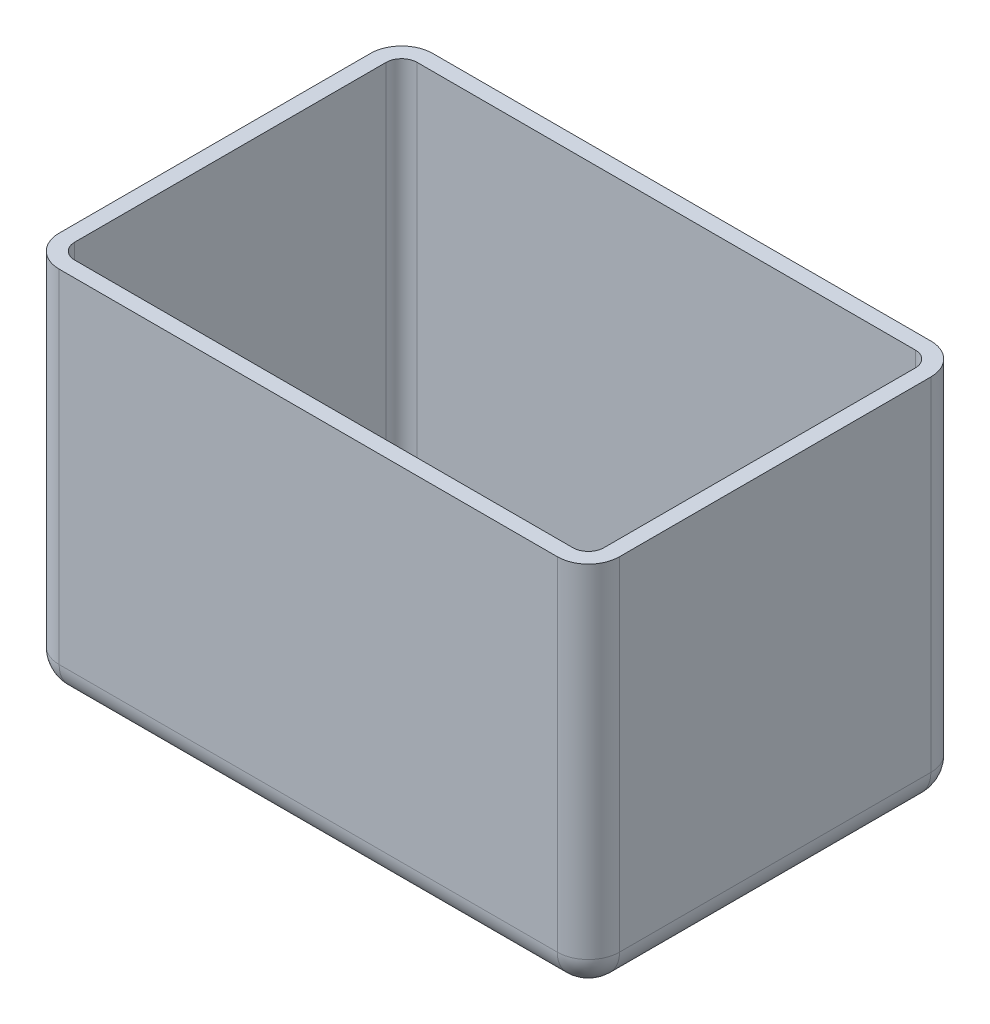
ISO-10303-21;
HEADER;
FILE_DESCRIPTION(('STEP AP214'),'2;1');
FILE_NAME('part.step','',(''),(''),'','','');
FILE_SCHEMA(('AUTOMOTIVE_DESIGN { 1 0 10303 214 1 1 1 1 }'));
ENDSEC;
DATA;
#1=APPLICATION_CONTEXT('core data for automotive mechanical design processes');
#2=APPLICATION_PROTOCOL_DEFINITION('international standard','automotive_design',2000,#1);
#3=PRODUCT_CONTEXT('',#1,'mechanical');
#4=PRODUCT('Part','Part','',(#3));
#5=PRODUCT_RELATED_PRODUCT_CATEGORY('part','',(#4));
#6=PRODUCT_DEFINITION_FORMATION('','',#4);
#7=PRODUCT_DEFINITION_CONTEXT('part definition',#1,'design');
#8=PRODUCT_DEFINITION('design','',#6,#7);
#9=PRODUCT_DEFINITION_SHAPE('','',#8);
#10=(LENGTH_UNIT() NAMED_UNIT(*) SI_UNIT(.MILLI.,.METRE.));
#11=(NAMED_UNIT(*) PLANE_ANGLE_UNIT() SI_UNIT($,.RADIAN.));
#12=(NAMED_UNIT(*) SI_UNIT($,.STERADIAN.) SOLID_ANGLE_UNIT());
#13=UNCERTAINTY_MEASURE_WITH_UNIT(LENGTH_MEASURE(1.E-05),#10,'distance_accuracy_value','');
#14=(GEOMETRIC_REPRESENTATION_CONTEXT(3) GLOBAL_UNCERTAINTY_ASSIGNED_CONTEXT((#13)) GLOBAL_UNIT_ASSIGNED_CONTEXT((#10,
#11,#12)) REPRESENTATION_CONTEXT('',''));
#15=CARTESIAN_POINT('',(0.,0.,0.));
#16=DIRECTION('',(0.,0.,1.));
#17=DIRECTION('',(1.,0.,0.));
#18=AXIS2_PLACEMENT_3D('',#15,#16,#17);
#19=CARTESIAN_POINT('',(-203.2,25.4,127.));
#20=DIRECTION('',(0.,0.,1.));
#21=DIRECTION('',(1.,0.,0.));
#22=AXIS2_PLACEMENT_3D('',#19,#20,#21);
#23=SPHERICAL_SURFACE('',#22,25.4);
#24=CARTESIAN_POINT('',(-203.2,25.4,127.));
#25=DIRECTION('',(0.,1.,0.));
#26=DIRECTION('',(0.,0.,1.));
#27=AXIS2_PLACEMENT_3D('',#24,#25,#26);
#28=CIRCLE('',#27,25.4);
#29=CARTESIAN_POINT('',(-228.6,25.4,127.));
#30=VERTEX_POINT('',#29);
#31=CARTESIAN_POINT('',(-203.2,25.4,152.4));
#32=VERTEX_POINT('',#31);
#33=EDGE_CURVE('E11',#30,#32,#28,.T.);
#34=ORIENTED_EDGE('',*,*,#33,.F.);
#35=CARTESIAN_POINT('',(-203.2,25.4,127.));
#36=DIRECTION('',(0.,0.,-1.));
#37=DIRECTION('',(-1.,0.,0.));
#38=AXIS2_PLACEMENT_3D('',#35,#36,#37);
#39=CIRCLE('',#38,25.4);
#40=CARTESIAN_POINT('',(-203.2,0.,127.));
#41=VERTEX_POINT('',#40);
#42=EDGE_CURVE('E354',#41,#30,#39,.T.);
#43=ORIENTED_EDGE('',*,*,#42,.F.);
#44=CARTESIAN_POINT('',(-203.2,25.4,127.));
#45=DIRECTION('',(-1.,0.,0.));
#46=DIRECTION('',(0.,0.,1.));
#47=AXIS2_PLACEMENT_3D('',#44,#45,#46);
#48=CIRCLE('',#47,25.4);
#49=EDGE_CURVE('E357',#32,#41,#48,.F.);
#50=ORIENTED_EDGE('',*,*,#49,.F.);
#51=EDGE_LOOP('',(#34,#43,#50));
#52=FACE_BOUND('',#51,.T.);
#53=ADVANCED_FACE('F36',(#52),#23,.T.);
#54=CARTESIAN_POINT('',(-203.2,304.8,127.));
#55=DIRECTION('',(0.,1.,0.));
#56=DIRECTION('',(0.,0.,1.));
#57=AXIS2_PLACEMENT_3D('',#54,#55,#56);
#58=CYLINDRICAL_SURFACE('',#57,25.4);
#59=DIRECTION('',(0.,1.,0.));
#60=VECTOR('',#59,1.);
#61=CARTESIAN_POINT('',(-228.6,304.8,127.));
#62=LINE('',#61,#60);
#63=CARTESIAN_POINT('',(-228.6,304.8,127.));
#64=VERTEX_POINT('',#63);
#65=EDGE_CURVE('E359',#30,#64,#62,.T.);
#66=ORIENTED_EDGE('',*,*,#65,.F.);
#67=ORIENTED_EDGE('',*,*,#33,.T.);
#68=DIRECTION('',(0.,1.,0.));
#69=VECTOR('',#68,1.);
#70=CARTESIAN_POINT('',(-203.2,304.8,152.4));
#71=LINE('',#70,#69);
#72=CARTESIAN_POINT('',(-203.2,304.8,152.4));
#73=VERTEX_POINT('',#72);
#74=EDGE_CURVE('E362',#73,#32,#71,.F.);
#75=ORIENTED_EDGE('',*,*,#74,.F.);
#76=CARTESIAN_POINT('',(-203.2,304.8,127.));
#77=DIRECTION('',(0.,-1.,0.));
#78=DIRECTION('',(0.,0.,-1.));
#79=AXIS2_PLACEMENT_3D('',#76,#77,#78);
#80=CIRCLE('',#79,25.4);
#81=EDGE_CURVE('E44',#64,#73,#80,.F.);
#82=ORIENTED_EDGE('',*,*,#81,.F.);
#83=EDGE_LOOP('',(#66,#67,#75,#82));
#84=FACE_BOUND('',#83,.T.);
#85=ADVANCED_FACE('F38',(#84),#58,.T.);
#86=CARTESIAN_POINT('',(-203.2,25.4,-127.));
#87=DIRECTION('',(0.,0.,1.));
#88=DIRECTION('',(1.,0.,0.));
#89=AXIS2_PLACEMENT_3D('',#86,#87,#88);
#90=SPHERICAL_SURFACE('',#89,25.4);
#91=CARTESIAN_POINT('',(-203.2,25.4,-127.));
#92=DIRECTION('',(0.,1.,0.));
#93=DIRECTION('',(0.,0.,1.));
#94=AXIS2_PLACEMENT_3D('',#91,#92,#93);
#95=CIRCLE('',#94,25.4);
#96=CARTESIAN_POINT('',(-203.2,25.4,-152.4));
#97=VERTEX_POINT('',#96);
#98=CARTESIAN_POINT('',(-228.6,25.4,-127.));
#99=VERTEX_POINT('',#98);
#100=EDGE_CURVE('E352',#97,#99,#95,.T.);
#101=ORIENTED_EDGE('',*,*,#100,.F.);
#102=CARTESIAN_POINT('',(-203.2,25.4,-127.));
#103=DIRECTION('',(1.,0.,0.));
#104=DIRECTION('',(0.,0.,-1.));
#105=AXIS2_PLACEMENT_3D('',#102,#103,#104);
#106=CIRCLE('',#105,25.4);
#107=CARTESIAN_POINT('',(-203.2,0.,-127.));
#108=VERTEX_POINT('',#107);
#109=EDGE_CURVE('E339',#108,#97,#106,.T.);
#110=ORIENTED_EDGE('',*,*,#109,.F.);
#111=CARTESIAN_POINT('',(-203.2,25.4,-127.));
#112=DIRECTION('',(0.,0.,-1.));
#113=DIRECTION('',(-1.,0.,0.));
#114=AXIS2_PLACEMENT_3D('',#111,#112,#113);
#115=CIRCLE('',#114,25.4);
#116=EDGE_CURVE('E342',#99,#108,#115,.F.);
#117=ORIENTED_EDGE('',*,*,#116,.F.);
#118=EDGE_LOOP('',(#101,#110,#117));
#119=FACE_BOUND('',#118,.T.);
#120=ADVANCED_FACE('F438',(#119),#90,.T.);
#121=CARTESIAN_POINT('',(-203.2,304.8,-127.));
#122=DIRECTION('',(0.,1.,0.));
#123=DIRECTION('',(0.,0.,1.));
#124=AXIS2_PLACEMENT_3D('',#121,#122,#123);
#125=CYLINDRICAL_SURFACE('',#124,25.4);
#126=DIRECTION('',(0.,1.,0.));
#127=VECTOR('',#126,1.);
#128=CARTESIAN_POINT('',(-203.2,304.8,-152.4));
#129=LINE('',#128,#127);
#130=CARTESIAN_POINT('',(-203.2,304.8,-152.4));
#131=VERTEX_POINT('',#130);
#132=EDGE_CURVE('E344',#97,#131,#129,.T.);
#133=ORIENTED_EDGE('',*,*,#132,.F.);
#134=ORIENTED_EDGE('',*,*,#100,.T.);
#135=DIRECTION('',(0.,1.,0.));
#136=VECTOR('',#135,1.);
#137=CARTESIAN_POINT('',(-228.6,304.8,-127.));
#138=LINE('',#137,#136);
#139=CARTESIAN_POINT('',(-228.6,304.8,-127.));
#140=VERTEX_POINT('',#139);
#141=EDGE_CURVE('E347',#140,#99,#138,.F.);
#142=ORIENTED_EDGE('',*,*,#141,.F.);
#143=CARTESIAN_POINT('',(-203.2,304.8,-127.));
#144=DIRECTION('',(0.,-1.,0.));
#145=DIRECTION('',(0.,0.,-1.));
#146=AXIS2_PLACEMENT_3D('',#143,#144,#145);
#147=CIRCLE('',#146,25.4);
#148=EDGE_CURVE('E350',#131,#140,#147,.F.);
#149=ORIENTED_EDGE('',*,*,#148,.F.);
#150=EDGE_LOOP('',(#133,#134,#142,#149));
#151=FACE_BOUND('',#150,.T.);
#152=ADVANCED_FACE('F414',(#151),#125,.T.);
#153=CARTESIAN_POINT('',(203.2,25.4,-127.));
#154=DIRECTION('',(0.,0.,1.));
#155=DIRECTION('',(1.,0.,0.));
#156=AXIS2_PLACEMENT_3D('',#153,#154,#155);
#157=SPHERICAL_SURFACE('',#156,25.4);
#158=CARTESIAN_POINT('',(203.2,25.4,-127.));
#159=DIRECTION('',(0.,1.,0.));
#160=DIRECTION('',(0.,0.,1.));
#161=AXIS2_PLACEMENT_3D('',#158,#159,#160);
#162=CIRCLE('',#161,25.4);
#163=CARTESIAN_POINT('',(228.6,25.4,-127.));
#164=VERTEX_POINT('',#163);
#165=CARTESIAN_POINT('',(203.2,25.4,-152.4));
#166=VERTEX_POINT('',#165);
#167=EDGE_CURVE('E337',#164,#166,#162,.T.);
#168=ORIENTED_EDGE('',*,*,#167,.F.);
#169=CARTESIAN_POINT('',(203.2,25.4,-127.));
#170=DIRECTION('',(0.,0.,1.));
#171=DIRECTION('',(1.,0.,0.));
#172=AXIS2_PLACEMENT_3D('',#169,#170,#171);
#173=CIRCLE('',#172,25.4);
#174=CARTESIAN_POINT('',(203.2,0.,-127.));
#175=VERTEX_POINT('',#174);
#176=EDGE_CURVE('E324',#175,#164,#173,.T.);
#177=ORIENTED_EDGE('',*,*,#176,.F.);
#178=CARTESIAN_POINT('',(203.2,25.4,-127.));
#179=DIRECTION('',(1.,0.,0.));
#180=DIRECTION('',(0.,0.,-1.));
#181=AXIS2_PLACEMENT_3D('',#178,#179,#180);
#182=CIRCLE('',#181,25.4);
#183=EDGE_CURVE('E327',#166,#175,#182,.F.);
#184=ORIENTED_EDGE('',*,*,#183,.F.);
#185=EDGE_LOOP('',(#168,#177,#184));
#186=FACE_BOUND('',#185,.T.);
#187=ADVANCED_FACE('F401',(#186),#157,.T.);
#188=CARTESIAN_POINT('',(203.2,304.8,-127.));
#189=DIRECTION('',(0.,1.,0.));
#190=DIRECTION('',(0.,0.,1.));
#191=AXIS2_PLACEMENT_3D('',#188,#189,#190);
#192=CYLINDRICAL_SURFACE('',#191,25.4);
#193=DIRECTION('',(0.,1.,0.));
#194=VECTOR('',#193,1.);
#195=CARTESIAN_POINT('',(228.6,304.8,-127.));
#196=LINE('',#195,#194);
#197=CARTESIAN_POINT('',(228.6,304.8,-127.));
#198=VERTEX_POINT('',#197);
#199=EDGE_CURVE('E329',#164,#198,#196,.T.);
#200=ORIENTED_EDGE('',*,*,#199,.F.);
#201=ORIENTED_EDGE('',*,*,#167,.T.);
#202=DIRECTION('',(0.,1.,0.));
#203=VECTOR('',#202,1.);
#204=CARTESIAN_POINT('',(203.2,304.8,-152.4));
#205=LINE('',#204,#203);
#206=CARTESIAN_POINT('',(203.2,304.8,-152.4));
#207=VERTEX_POINT('',#206);
#208=EDGE_CURVE('E332',#207,#166,#205,.F.);
#209=ORIENTED_EDGE('',*,*,#208,.F.);
#210=CARTESIAN_POINT('',(203.2,304.8,-127.));
#211=DIRECTION('',(0.,-1.,0.));
#212=DIRECTION('',(0.,0.,-1.));
#213=AXIS2_PLACEMENT_3D('',#210,#211,#212);
#214=CIRCLE('',#213,25.4);
#215=EDGE_CURVE('E335',#198,#207,#214,.F.);
#216=ORIENTED_EDGE('',*,*,#215,.F.);
#217=EDGE_LOOP('',(#200,#201,#209,#216));
#218=FACE_BOUND('',#217,.T.);
#219=ADVANCED_FACE('F394',(#218),#192,.T.);
#220=CARTESIAN_POINT('',(203.2,25.4,127.));
#221=DIRECTION('',(0.,0.,1.));
#222=DIRECTION('',(1.,0.,0.));
#223=AXIS2_PLACEMENT_3D('',#220,#221,#222);
#224=SPHERICAL_SURFACE('',#223,25.4);
#225=CARTESIAN_POINT('',(203.2,25.4,127.));
#226=DIRECTION('',(0.,1.,0.));
#227=DIRECTION('',(0.,0.,1.));
#228=AXIS2_PLACEMENT_3D('',#225,#226,#227);
#229=CIRCLE('',#228,25.4);
#230=CARTESIAN_POINT('',(203.2,25.4,152.4));
#231=VERTEX_POINT('',#230);
#232=CARTESIAN_POINT('',(228.6,25.4,127.));
#233=VERTEX_POINT('',#232);
#234=EDGE_CURVE('E322',#231,#233,#229,.T.);
#235=ORIENTED_EDGE('',*,*,#234,.F.);
#236=CARTESIAN_POINT('',(203.2,25.4,127.));
#237=DIRECTION('',(-1.,0.,0.));
#238=DIRECTION('',(0.,0.,1.));
#239=AXIS2_PLACEMENT_3D('',#236,#237,#238);
#240=CIRCLE('',#239,25.4);
#241=CARTESIAN_POINT('',(203.2,0.,127.));
#242=VERTEX_POINT('',#241);
#243=EDGE_CURVE('E309',#242,#231,#240,.T.);
#244=ORIENTED_EDGE('',*,*,#243,.F.);
#245=CARTESIAN_POINT('',(203.2,25.4,127.));
#246=DIRECTION('',(0.,0.,1.));
#247=DIRECTION('',(1.,0.,0.));
#248=AXIS2_PLACEMENT_3D('',#245,#246,#247);
#249=CIRCLE('',#248,25.4);
#250=EDGE_CURVE('E312',#233,#242,#249,.F.);
#251=ORIENTED_EDGE('',*,*,#250,.F.);
#252=EDGE_LOOP('',(#235,#244,#251));
#253=FACE_BOUND('',#252,.T.);
#254=ADVANCED_FACE('F380',(#253),#224,.T.);
#255=CARTESIAN_POINT('',(203.2,304.8,127.));
#256=DIRECTION('',(0.,1.,0.));
#257=DIRECTION('',(0.,0.,1.));
#258=AXIS2_PLACEMENT_3D('',#255,#256,#257);
#259=CYLINDRICAL_SURFACE('',#258,25.4);
#260=DIRECTION('',(0.,1.,0.));
#261=VECTOR('',#260,1.);
#262=CARTESIAN_POINT('',(203.2,304.8,152.4));
#263=LINE('',#262,#261);
#264=CARTESIAN_POINT('',(203.2,304.8,152.4));
#265=VERTEX_POINT('',#264);
#266=EDGE_CURVE('E314',#231,#265,#263,.T.);
#267=ORIENTED_EDGE('',*,*,#266,.F.);
#268=ORIENTED_EDGE('',*,*,#234,.T.);
#269=DIRECTION('',(0.,1.,0.));
#270=VECTOR('',#269,1.);
#271=CARTESIAN_POINT('',(228.6,304.8,127.));
#272=LINE('',#271,#270);
#273=CARTESIAN_POINT('',(228.6,304.8,127.));
#274=VERTEX_POINT('',#273);
#275=EDGE_CURVE('E317',#274,#233,#272,.F.);
#276=ORIENTED_EDGE('',*,*,#275,.F.);
#277=CARTESIAN_POINT('',(203.2,304.8,127.));
#278=DIRECTION('',(0.,-1.,0.));
#279=DIRECTION('',(0.,0.,-1.));
#280=AXIS2_PLACEMENT_3D('',#277,#278,#279);
#281=CIRCLE('',#280,25.4);
#282=EDGE_CURVE('E320',#265,#274,#281,.F.);
#283=ORIENTED_EDGE('',*,*,#282,.F.);
#284=EDGE_LOOP('',(#267,#268,#276,#283));
#285=FACE_BOUND('',#284,.T.);
#286=ADVANCED_FACE('F386',(#285),#259,.T.);
#287=CARTESIAN_POINT('',(-203.2,25.4,152.4));
#288=DIRECTION('',(0.,0.,-1.));
#289=DIRECTION('',(-1.,0.,0.));
#290=AXIS2_PLACEMENT_3D('',#287,#288,#289);
#291=CYLINDRICAL_SURFACE('',#290,25.4);
#292=DIRECTION('',(0.,0.,1.));
#293=VECTOR('',#292,1.);
#294=CARTESIAN_POINT('',(-203.2,0.,152.4));
#295=LINE('',#294,#293);
#296=EDGE_CURVE('E288',#41,#108,#295,.F.);
#297=ORIENTED_EDGE('',*,*,#296,.F.);
#298=ORIENTED_EDGE('',*,*,#42,.T.);
#299=DIRECTION('',(0.,0.,1.));
#300=VECTOR('',#299,1.);
#301=CARTESIAN_POINT('',(-228.6,25.4,152.4));
#302=LINE('',#301,#300);
#303=EDGE_CURVE('E306',#99,#30,#302,.T.);
#304=ORIENTED_EDGE('',*,*,#303,.F.);
#305=ORIENTED_EDGE('',*,*,#116,.T.);
#306=EDGE_LOOP('',(#297,#298,#304,#305));
#307=FACE_BOUND('',#306,.T.);
#308=ADVANCED_FACE('F421',(#307),#291,.T.);
#309=CARTESIAN_POINT('',(-228.6,25.4,-127.));
#310=DIRECTION('',(1.,0.,0.));
#311=DIRECTION('',(0.,0.,-1.));
#312=AXIS2_PLACEMENT_3D('',#309,#310,#311);
#313=CYLINDRICAL_SURFACE('',#312,25.4);
#314=DIRECTION('',(-1.,0.,0.));
#315=VECTOR('',#314,1.);
#316=CARTESIAN_POINT('',(-228.6,0.,-127.));
#317=LINE('',#316,#315);
#318=EDGE_CURVE('E291',#108,#175,#317,.F.);
#319=ORIENTED_EDGE('',*,*,#318,.F.);
#320=ORIENTED_EDGE('',*,*,#109,.T.);
#321=DIRECTION('',(-1.,0.,0.));
#322=VECTOR('',#321,1.);
#323=CARTESIAN_POINT('',(-228.6,25.4,-152.4));
#324=LINE('',#323,#322);
#325=EDGE_CURVE('E303',#166,#97,#324,.T.);
#326=ORIENTED_EDGE('',*,*,#325,.F.);
#327=ORIENTED_EDGE('',*,*,#183,.T.);
#328=EDGE_LOOP('',(#319,#320,#326,#327));
#329=FACE_BOUND('',#328,.T.);
#330=ADVANCED_FACE('F405',(#329),#313,.T.);
#331=CARTESIAN_POINT('',(203.2,25.4,152.4));
#332=DIRECTION('',(0.,0.,1.));
#333=DIRECTION('',(1.,0.,0.));
#334=AXIS2_PLACEMENT_3D('',#331,#332,#333);
#335=CYLINDRICAL_SURFACE('',#334,25.4);
#336=DIRECTION('',(0.,0.,-1.));
#337=VECTOR('',#336,1.);
#338=CARTESIAN_POINT('',(203.2,0.,152.4));
#339=LINE('',#338,#337);
#340=EDGE_CURVE('E294',#175,#242,#339,.F.);
#341=ORIENTED_EDGE('',*,*,#340,.F.);
#342=ORIENTED_EDGE('',*,*,#176,.T.);
#343=DIRECTION('',(0.,0.,-1.));
#344=VECTOR('',#343,1.);
#345=CARTESIAN_POINT('',(228.6,25.4,152.4));
#346=LINE('',#345,#344);
#347=EDGE_CURVE('E300',#233,#164,#346,.T.);
#348=ORIENTED_EDGE('',*,*,#347,.F.);
#349=ORIENTED_EDGE('',*,*,#250,.T.);
#350=EDGE_LOOP('',(#341,#342,#348,#349));
#351=FACE_BOUND('',#350,.T.);
#352=ADVANCED_FACE('F398',(#351),#335,.T.);
#353=CARTESIAN_POINT('',(-228.6,25.4,127.));
#354=DIRECTION('',(-1.,0.,0.));
#355=DIRECTION('',(0.,0.,1.));
#356=AXIS2_PLACEMENT_3D('',#353,#354,#355);
#357=CYLINDRICAL_SURFACE('',#356,25.4);
#358=DIRECTION('',(1.,0.,0.));
#359=VECTOR('',#358,1.);
#360=CARTESIAN_POINT('',(-228.6,25.4,152.4));
#361=LINE('',#360,#359);
#362=EDGE_CURVE('E286',#32,#231,#361,.T.);
#363=ORIENTED_EDGE('',*,*,#362,.F.);
#364=ORIENTED_EDGE('',*,*,#49,.T.);
#365=DIRECTION('',(1.,0.,0.));
#366=VECTOR('',#365,1.);
#367=CARTESIAN_POINT('',(-228.6,0.,127.));
#368=LINE('',#367,#366);
#369=EDGE_CURVE('E297',#242,#41,#368,.F.);
#370=ORIENTED_EDGE('',*,*,#369,.F.);
#371=ORIENTED_EDGE('',*,*,#243,.T.);
#372=EDGE_LOOP('',(#363,#364,#370,#371));
#373=FACE_BOUND('',#372,.T.);
#374=ADVANCED_FACE('F376',(#373),#357,.T.);
#375=CARTESIAN_POINT('',(228.6,304.8,152.4));
#376=DIRECTION('',(-1.,0.,0.));
#377=DIRECTION('',(0.,0.,1.));
#378=AXIS2_PLACEMENT_3D('',#375,#376,#377);
#379=PLANE('',#378);
#380=ORIENTED_EDGE('',*,*,#347,.T.);
#381=ORIENTED_EDGE('',*,*,#199,.T.);
#382=DIRECTION('',(0.,0.,-1.));
#383=VECTOR('',#382,1.);
#384=CARTESIAN_POINT('',(228.6,304.8,152.4));
#385=LINE('',#384,#383);
#386=EDGE_CURVE('E182',#274,#198,#385,.T.);
#387=ORIENTED_EDGE('',*,*,#386,.F.);
#388=ORIENTED_EDGE('',*,*,#275,.T.);
#389=EDGE_LOOP('',(#380,#381,#387,#388));
#390=FACE_BOUND('',#389,.T.);
#391=ADVANCED_FACE('F391',(#390),#379,.F.);
#392=CARTESIAN_POINT('',(-228.6,304.8,-152.4));
#393=DIRECTION('',(0.,0.,1.));
#394=DIRECTION('',(1.,0.,0.));
#395=AXIS2_PLACEMENT_3D('',#392,#393,#394);
#396=PLANE('',#395);
#397=ORIENTED_EDGE('',*,*,#325,.T.);
#398=ORIENTED_EDGE('',*,*,#132,.T.);
#399=DIRECTION('',(-1.,0.,0.));
#400=VECTOR('',#399,1.);
#401=CARTESIAN_POINT('',(-228.6,304.8,-152.4));
#402=LINE('',#401,#400);
#403=EDGE_CURVE('E279',#207,#131,#402,.T.);
#404=ORIENTED_EDGE('',*,*,#403,.F.);
#405=ORIENTED_EDGE('',*,*,#208,.T.);
#406=EDGE_LOOP('',(#397,#398,#404,#405));
#407=FACE_BOUND('',#406,.T.);
#408=ADVANCED_FACE('F408',(#407),#396,.F.);
#409=CARTESIAN_POINT('',(-228.6,304.8,152.4));
#410=DIRECTION('',(1.,0.,0.));
#411=DIRECTION('',(0.,0.,-1.));
#412=AXIS2_PLACEMENT_3D('',#409,#410,#411);
#413=PLANE('',#412);
#414=ORIENTED_EDGE('',*,*,#303,.T.);
#415=ORIENTED_EDGE('',*,*,#65,.T.);
#416=DIRECTION('',(0.,0.,1.));
#417=VECTOR('',#416,1.);
#418=CARTESIAN_POINT('',(-228.6,304.8,152.4));
#419=LINE('',#418,#417);
#420=EDGE_CURVE('E282',#140,#64,#419,.T.);
#421=ORIENTED_EDGE('',*,*,#420,.F.);
#422=ORIENTED_EDGE('',*,*,#141,.T.);
#423=EDGE_LOOP('',(#414,#415,#421,#422));
#424=FACE_BOUND('',#423,.T.);
#425=ADVANCED_FACE('F417',(#424),#413,.F.);
#426=CARTESIAN_POINT('',(-228.6,304.8,152.4));
#427=DIRECTION('',(0.,0.,-1.));
#428=DIRECTION('',(-1.,0.,0.));
#429=AXIS2_PLACEMENT_3D('',#426,#427,#428);
#430=PLANE('',#429);
#431=DIRECTION('',(1.,0.,0.));
#432=VECTOR('',#431,1.);
#433=CARTESIAN_POINT('',(-228.6,304.8,152.4));
#434=LINE('',#433,#432);
#435=EDGE_CURVE('E284',#73,#265,#434,.T.);
#436=ORIENTED_EDGE('',*,*,#435,.F.);
#437=ORIENTED_EDGE('',*,*,#74,.T.);
#438=ORIENTED_EDGE('',*,*,#362,.T.);
#439=ORIENTED_EDGE('',*,*,#266,.T.);
#440=EDGE_LOOP('',(#436,#437,#438,#439));
#441=FACE_BOUND('',#440,.T.);
#442=ADVANCED_FACE('F367',(#441),#430,.F.);
#443=CARTESIAN_POINT('',(0.,304.8,0.));
#444=DIRECTION('',(0.,-1.,0.));
#445=DIRECTION('',(0.,0.,-1.));
#446=AXIS2_PLACEMENT_3D('',#443,#444,#445);
#447=PLANE('',#446);
#448=DIRECTION('',(0.,0.,1.));
#449=VECTOR('',#448,1.);
#450=CARTESIAN_POINT('',(-215.9,304.8,0.));
#451=LINE('',#450,#449);
#452=CARTESIAN_POINT('',(-215.9,304.8,-127.));
#453=VERTEX_POINT('',#452);
#454=CARTESIAN_POINT('',(-215.9,304.8,127.));
#455=VERTEX_POINT('',#454);
#456=EDGE_CURVE('E192',#453,#455,#451,.T.);
#457=ORIENTED_EDGE('',*,*,#456,.F.);
#458=CARTESIAN_POINT('',(-203.2,304.8,-127.));
#459=DIRECTION('',(0.,-1.,0.));
#460=DIRECTION('',(0.,0.,-1.));
#461=AXIS2_PLACEMENT_3D('',#458,#459,#460);
#462=CIRCLE('',#461,12.7);
#463=CARTESIAN_POINT('',(-203.2,304.8,-139.7));
#464=VERTEX_POINT('',#463);
#465=EDGE_CURVE('E224',#464,#453,#462,.F.);
#466=ORIENTED_EDGE('',*,*,#465,.F.);
#467=DIRECTION('',(-1.,0.,0.));
#468=VECTOR('',#467,1.);
#469=CARTESIAN_POINT('',(0.,304.8,-139.7));
#470=LINE('',#469,#468);
#471=CARTESIAN_POINT('',(203.2,304.8,-139.7));
#472=VERTEX_POINT('',#471);
#473=EDGE_CURVE('E51',#472,#464,#470,.T.);
#474=ORIENTED_EDGE('',*,*,#473,.F.);
#475=CARTESIAN_POINT('',(203.2,304.8,-127.));
#476=DIRECTION('',(0.,-1.,0.));
#477=DIRECTION('',(0.,0.,-1.));
#478=AXIS2_PLACEMENT_3D('',#475,#476,#477);
#479=CIRCLE('',#478,12.7);
#480=CARTESIAN_POINT('',(215.9,304.8,-127.));
#481=VERTEX_POINT('',#480);
#482=EDGE_CURVE('E241',#481,#472,#479,.F.);
#483=ORIENTED_EDGE('',*,*,#482,.F.);
#484=DIRECTION('',(0.,0.,-1.));
#485=VECTOR('',#484,1.);
#486=CARTESIAN_POINT('',(215.9,304.8,0.));
#487=LINE('',#486,#485);
#488=CARTESIAN_POINT('',(215.9,304.8,127.));
#489=VERTEX_POINT('',#488);
#490=EDGE_CURVE('E270',#489,#481,#487,.T.);
#491=ORIENTED_EDGE('',*,*,#490,.F.);
#492=CARTESIAN_POINT('',(203.2,304.8,127.));
#493=DIRECTION('',(0.,-1.,0.));
#494=DIRECTION('',(0.,0.,-1.));
#495=AXIS2_PLACEMENT_3D('',#492,#493,#494);
#496=CIRCLE('',#495,12.7);
#497=CARTESIAN_POINT('',(203.2,304.8,139.7));
#498=VERTEX_POINT('',#497);
#499=EDGE_CURVE('E256',#498,#489,#496,.F.);
#500=ORIENTED_EDGE('',*,*,#499,.F.);
#501=DIRECTION('',(1.,0.,0.));
#502=VECTOR('',#501,1.);
#503=CARTESIAN_POINT('',(0.,304.8,139.7));
#504=LINE('',#503,#502);
#505=CARTESIAN_POINT('',(-203.2,304.8,139.7));
#506=VERTEX_POINT('',#505);
#507=EDGE_CURVE('E265',#506,#498,#504,.T.);
#508=ORIENTED_EDGE('',*,*,#507,.F.);
#509=CARTESIAN_POINT('',(-203.2,304.8,127.));
#510=DIRECTION('',(0.,-1.,0.));
#511=DIRECTION('',(0.,0.,-1.));
#512=AXIS2_PLACEMENT_3D('',#509,#510,#511);
#513=CIRCLE('',#512,12.7);
#514=EDGE_CURVE('E183',#455,#506,#513,.F.);
#515=ORIENTED_EDGE('',*,*,#514,.F.);
#516=EDGE_LOOP('',(#457,#466,#474,#483,#491,#500,#508,#515));
#517=FACE_BOUND('',#516,.T.);
#518=ORIENTED_EDGE('',*,*,#420,.T.);
#519=ORIENTED_EDGE('',*,*,#81,.T.);
#520=ORIENTED_EDGE('',*,*,#435,.T.);
#521=ORIENTED_EDGE('',*,*,#282,.T.);
#522=ORIENTED_EDGE('',*,*,#386,.T.);
#523=ORIENTED_EDGE('',*,*,#215,.T.);
#524=ORIENTED_EDGE('',*,*,#403,.T.);
#525=ORIENTED_EDGE('',*,*,#148,.T.);
#526=EDGE_LOOP('',(#518,#519,#520,#521,#522,#523,#524,#525));
#527=FACE_BOUND('',#526,.T.);
#528=ADVANCED_FACE('F388',(#517,#527),#447,.F.);
#529=CARTESIAN_POINT('',(0.,0.,0.));
#530=DIRECTION('',(0.,-1.,0.));
#531=DIRECTION('',(0.,0.,-1.));
#532=AXIS2_PLACEMENT_3D('',#529,#530,#531);
#533=PLANE('',#532);
#534=ORIENTED_EDGE('',*,*,#340,.T.);
#535=ORIENTED_EDGE('',*,*,#369,.T.);
#536=ORIENTED_EDGE('',*,*,#296,.T.);
#537=ORIENTED_EDGE('',*,*,#318,.T.);
#538=EDGE_LOOP('',(#534,#535,#536,#537));
#539=FACE_BOUND('',#538,.T.);
#540=ADVANCED_FACE('F423',(#539),#533,.T.);
#541=CARTESIAN_POINT('',(-203.2,25.4,127.));
#542=DIRECTION('',(0.,0.,1.));
#543=DIRECTION('',(1.,0.,0.));
#544=AXIS2_PLACEMENT_3D('',#541,#542,#543);
#545=SPHERICAL_SURFACE('',#544,12.7);
#546=CARTESIAN_POINT('',(-203.2,25.4,127.));
#547=DIRECTION('',(0.,1.,0.));
#548=DIRECTION('',(0.,0.,1.));
#549=AXIS2_PLACEMENT_3D('',#546,#547,#548);
#550=CIRCLE('',#549,12.7);
#551=CARTESIAN_POINT('',(-215.9,25.4,127.));
#552=VERTEX_POINT('',#551);
#553=CARTESIAN_POINT('',(-203.2,25.4,139.7));
#554=VERTEX_POINT('',#553);
#555=EDGE_CURVE('E172',#552,#554,#550,.T.);
#556=ORIENTED_EDGE('',*,*,#555,.T.);
#557=CARTESIAN_POINT('',(-203.2,25.4,127.));
#558=DIRECTION('',(-1.,0.,0.));
#559=DIRECTION('',(0.,0.,1.));
#560=AXIS2_PLACEMENT_3D('',#557,#558,#559);
#561=CIRCLE('',#560,12.7);
#562=CARTESIAN_POINT('',(-203.2,12.7,127.));
#563=VERTEX_POINT('',#562);
#564=EDGE_CURVE('E194',#554,#563,#561,.F.);
#565=ORIENTED_EDGE('',*,*,#564,.T.);
#566=CARTESIAN_POINT('',(-203.2,25.4,127.));
#567=DIRECTION('',(0.,0.,-1.));
#568=DIRECTION('',(-1.,0.,0.));
#569=AXIS2_PLACEMENT_3D('',#566,#567,#568);
#570=CIRCLE('',#569,12.7);
#571=EDGE_CURVE('E197',#563,#552,#570,.T.);
#572=ORIENTED_EDGE('',*,*,#571,.T.);
#573=EDGE_LOOP('',(#556,#565,#572));
#574=FACE_BOUND('',#573,.T.);
#575=ADVANCED_FACE('F198',(#574),#545,.F.);
#576=CARTESIAN_POINT('',(-203.2,304.8,127.));
#577=DIRECTION('',(0.,1.,0.));
#578=DIRECTION('',(0.,0.,1.));
#579=AXIS2_PLACEMENT_3D('',#576,#577,#578);
#580=CYLINDRICAL_SURFACE('',#579,12.7);
#581=DIRECTION('',(0.,1.,0.));
#582=VECTOR('',#581,1.);
#583=CARTESIAN_POINT('',(-215.9,304.8,127.));
#584=LINE('',#583,#582);
#585=EDGE_CURVE('E175',#552,#455,#584,.T.);
#586=ORIENTED_EDGE('',*,*,#585,.T.);
#587=ORIENTED_EDGE('',*,*,#514,.T.);
#588=DIRECTION('',(0.,1.,0.));
#589=VECTOR('',#588,1.);
#590=CARTESIAN_POINT('',(-203.2,304.8,139.7));
#591=LINE('',#590,#589);
#592=EDGE_CURVE('E178',#506,#554,#591,.F.);
#593=ORIENTED_EDGE('',*,*,#592,.T.);
#594=ORIENTED_EDGE('',*,*,#555,.F.);
#595=EDGE_LOOP('',(#586,#587,#593,#594));
#596=FACE_BOUND('',#595,.T.);
#597=ADVANCED_FACE('F174',(#596),#580,.F.);
#598=CARTESIAN_POINT('',(-203.2,25.4,-127.));
#599=DIRECTION('',(0.,0.,1.));
#600=DIRECTION('',(1.,0.,0.));
#601=AXIS2_PLACEMENT_3D('',#598,#599,#600);
#602=SPHERICAL_SURFACE('',#601,12.7);
#603=CARTESIAN_POINT('',(-203.2,25.4,-127.));
#604=DIRECTION('',(0.,1.,0.));
#605=DIRECTION('',(0.,0.,1.));
#606=AXIS2_PLACEMENT_3D('',#603,#604,#605);
#607=CIRCLE('',#606,12.7);
#608=CARTESIAN_POINT('',(-203.2,25.4,-139.7));
#609=VERTEX_POINT('',#608);
#610=CARTESIAN_POINT('',(-215.9,25.4,-127.));
#611=VERTEX_POINT('',#610);
#612=EDGE_CURVE('E202',#609,#611,#607,.T.);
#613=ORIENTED_EDGE('',*,*,#612,.T.);
#614=CARTESIAN_POINT('',(-203.2,25.4,-127.));
#615=DIRECTION('',(0.,0.,-1.));
#616=DIRECTION('',(-1.,0.,0.));
#617=AXIS2_PLACEMENT_3D('',#614,#615,#616);
#618=CIRCLE('',#617,12.7);
#619=CARTESIAN_POINT('',(-203.2,12.7,-127.));
#620=VERTEX_POINT('',#619);
#621=EDGE_CURVE('E206',#611,#620,#618,.F.);
#622=ORIENTED_EDGE('',*,*,#621,.T.);
#623=CARTESIAN_POINT('',(-203.2,25.4,-127.));
#624=DIRECTION('',(1.,0.,0.));
#625=DIRECTION('',(0.,0.,-1.));
#626=AXIS2_PLACEMENT_3D('',#623,#624,#625);
#627=CIRCLE('',#626,12.7);
#628=EDGE_CURVE('E222',#620,#609,#627,.T.);
#629=ORIENTED_EDGE('',*,*,#628,.T.);
#630=EDGE_LOOP('',(#613,#622,#629));
#631=FACE_BOUND('',#630,.T.);
#632=ADVANCED_FACE('F492',(#631),#602,.F.);
#633=CARTESIAN_POINT('',(-203.2,304.8,-127.));
#634=DIRECTION('',(0.,1.,0.));
#635=DIRECTION('',(0.,0.,1.));
#636=AXIS2_PLACEMENT_3D('',#633,#634,#635);
#637=CYLINDRICAL_SURFACE('',#636,12.7);
#638=DIRECTION('',(0.,1.,0.));
#639=VECTOR('',#638,1.);
#640=CARTESIAN_POINT('',(-203.2,304.8,-139.7));
#641=LINE('',#640,#639);
#642=EDGE_CURVE('E221',#609,#464,#641,.T.);
#643=ORIENTED_EDGE('',*,*,#642,.T.);
#644=ORIENTED_EDGE('',*,*,#465,.T.);
#645=DIRECTION('',(0.,1.,0.));
#646=VECTOR('',#645,1.);
#647=CARTESIAN_POINT('',(-215.9,304.8,-127.));
#648=LINE('',#647,#646);
#649=EDGE_CURVE('E229',#453,#611,#648,.F.);
#650=ORIENTED_EDGE('',*,*,#649,.T.);
#651=ORIENTED_EDGE('',*,*,#612,.F.);
#652=EDGE_LOOP('',(#643,#644,#650,#651));
#653=FACE_BOUND('',#652,.T.);
#654=ADVANCED_FACE('F501',(#653),#637,.F.);
#655=CARTESIAN_POINT('',(203.2,25.4,-127.));
#656=DIRECTION('',(0.,0.,1.));
#657=DIRECTION('',(1.,0.,0.));
#658=AXIS2_PLACEMENT_3D('',#655,#656,#657);
#659=SPHERICAL_SURFACE('',#658,12.7);
#660=CARTESIAN_POINT('',(203.2,25.4,-127.));
#661=DIRECTION('',(0.,1.,0.));
#662=DIRECTION('',(0.,0.,1.));
#663=AXIS2_PLACEMENT_3D('',#660,#661,#662);
#664=CIRCLE('',#663,12.7);
#665=CARTESIAN_POINT('',(215.9,25.4,-127.));
#666=VERTEX_POINT('',#665);
#667=CARTESIAN_POINT('',(203.2,25.4,-139.7));
#668=VERTEX_POINT('',#667);
#669=EDGE_CURVE('E227',#666,#668,#664,.T.);
#670=ORIENTED_EDGE('',*,*,#669,.T.);
#671=CARTESIAN_POINT('',(203.2,25.4,-127.));
#672=DIRECTION('',(1.,0.,0.));
#673=DIRECTION('',(0.,0.,-1.));
#674=AXIS2_PLACEMENT_3D('',#671,#672,#673);
#675=CIRCLE('',#674,12.7);
#676=CARTESIAN_POINT('',(203.2,12.7,-127.));
#677=VERTEX_POINT('',#676);
#678=EDGE_CURVE('E236',#668,#677,#675,.F.);
#679=ORIENTED_EDGE('',*,*,#678,.T.);
#680=CARTESIAN_POINT('',(203.2,25.4,-127.));
#681=DIRECTION('',(0.,0.,1.));
#682=DIRECTION('',(1.,0.,0.));
#683=AXIS2_PLACEMENT_3D('',#680,#681,#682);
#684=CIRCLE('',#683,12.7);
#685=EDGE_CURVE('E239',#677,#666,#684,.T.);
#686=ORIENTED_EDGE('',*,*,#685,.T.);
#687=EDGE_LOOP('',(#670,#679,#686));
#688=FACE_BOUND('',#687,.T.);
#689=ADVANCED_FACE('F511',(#688),#659,.F.);
#690=CARTESIAN_POINT('',(203.2,304.8,-127.));
#691=DIRECTION('',(0.,1.,0.));
#692=DIRECTION('',(0.,0.,1.));
#693=AXIS2_PLACEMENT_3D('',#690,#691,#692);
#694=CYLINDRICAL_SURFACE('',#693,12.7);
#695=DIRECTION('',(0.,1.,0.));
#696=VECTOR('',#695,1.);
#697=CARTESIAN_POINT('',(215.9,304.8,-127.));
#698=LINE('',#697,#696);
#699=EDGE_CURVE('E238',#666,#481,#698,.T.);
#700=ORIENTED_EDGE('',*,*,#699,.T.);
#701=ORIENTED_EDGE('',*,*,#482,.T.);
#702=DIRECTION('',(0.,1.,0.));
#703=VECTOR('',#702,1.);
#704=CARTESIAN_POINT('',(203.2,304.8,-139.7));
#705=LINE('',#704,#703);
#706=EDGE_CURVE('E246',#472,#668,#705,.F.);
#707=ORIENTED_EDGE('',*,*,#706,.T.);
#708=ORIENTED_EDGE('',*,*,#669,.F.);
#709=EDGE_LOOP('',(#700,#701,#707,#708));
#710=FACE_BOUND('',#709,.T.);
#711=ADVANCED_FACE('F521',(#710),#694,.F.);
#712=CARTESIAN_POINT('',(203.2,25.4,127.));
#713=DIRECTION('',(0.,0.,1.));
#714=DIRECTION('',(1.,0.,0.));
#715=AXIS2_PLACEMENT_3D('',#712,#713,#714);
#716=SPHERICAL_SURFACE('',#715,12.7);
#717=CARTESIAN_POINT('',(203.2,25.4,127.));
#718=DIRECTION('',(0.,1.,0.));
#719=DIRECTION('',(0.,0.,1.));
#720=AXIS2_PLACEMENT_3D('',#717,#718,#719);
#721=CIRCLE('',#720,12.7);
#722=CARTESIAN_POINT('',(203.2,25.4,139.7));
#723=VERTEX_POINT('',#722);
#724=CARTESIAN_POINT('',(215.9,25.4,127.));
#725=VERTEX_POINT('',#724);
#726=EDGE_CURVE('E244',#723,#725,#721,.T.);
#727=ORIENTED_EDGE('',*,*,#726,.T.);
#728=CARTESIAN_POINT('',(203.2,25.4,127.));
#729=DIRECTION('',(0.,0.,1.));
#730=DIRECTION('',(1.,0.,0.));
#731=AXIS2_PLACEMENT_3D('',#728,#729,#730);
#732=CIRCLE('',#731,12.7);
#733=CARTESIAN_POINT('',(203.2,12.7,127.));
#734=VERTEX_POINT('',#733);
#735=EDGE_CURVE('E211',#725,#734,#732,.F.);
#736=ORIENTED_EDGE('',*,*,#735,.T.);
#737=CARTESIAN_POINT('',(203.2,25.4,127.));
#738=DIRECTION('',(-1.,0.,0.));
#739=DIRECTION('',(0.,0.,1.));
#740=AXIS2_PLACEMENT_3D('',#737,#738,#739);
#741=CIRCLE('',#740,12.7);
#742=EDGE_CURVE('E207',#734,#723,#741,.T.);
#743=ORIENTED_EDGE('',*,*,#742,.T.);
#744=EDGE_LOOP('',(#727,#736,#743));
#745=FACE_BOUND('',#744,.T.);
#746=ADVANCED_FACE('F531',(#745),#716,.F.);
#747=CARTESIAN_POINT('',(203.2,304.8,127.));
#748=DIRECTION('',(0.,1.,0.));
#749=DIRECTION('',(0.,0.,1.));
#750=AXIS2_PLACEMENT_3D('',#747,#748,#749);
#751=CYLINDRICAL_SURFACE('',#750,12.7);
#752=DIRECTION('',(0.,1.,0.));
#753=VECTOR('',#752,1.);
#754=CARTESIAN_POINT('',(203.2,304.8,139.7));
#755=LINE('',#754,#753);
#756=EDGE_CURVE('E255',#723,#498,#755,.T.);
#757=ORIENTED_EDGE('',*,*,#756,.T.);
#758=ORIENTED_EDGE('',*,*,#499,.T.);
#759=DIRECTION('',(0.,1.,0.));
#760=VECTOR('',#759,1.);
#761=CARTESIAN_POINT('',(215.9,304.8,127.));
#762=LINE('',#761,#760);
#763=EDGE_CURVE('E260',#489,#725,#762,.F.);
#764=ORIENTED_EDGE('',*,*,#763,.T.);
#765=ORIENTED_EDGE('',*,*,#726,.F.);
#766=EDGE_LOOP('',(#757,#758,#764,#765));
#767=FACE_BOUND('',#766,.T.);
#768=ADVANCED_FACE('F541',(#767),#751,.F.);
#769=CARTESIAN_POINT('',(-203.2,25.4,152.4));
#770=DIRECTION('',(0.,0.,-1.));
#771=DIRECTION('',(-1.,0.,0.));
#772=AXIS2_PLACEMENT_3D('',#769,#770,#771);
#773=CYLINDRICAL_SURFACE('',#772,12.7);
#774=DIRECTION('',(0.,0.,-1.));
#775=VECTOR('',#774,1.);
#776=CARTESIAN_POINT('',(-203.2,12.7,0.));
#777=LINE('',#776,#775);
#778=EDGE_CURVE('E218',#563,#620,#777,.T.);
#779=ORIENTED_EDGE('',*,*,#778,.T.);
#780=ORIENTED_EDGE('',*,*,#621,.F.);
#781=DIRECTION('',(0.,0.,-1.));
#782=VECTOR('',#781,1.);
#783=CARTESIAN_POINT('',(-215.9,25.4,152.4));
#784=LINE('',#783,#782);
#785=EDGE_CURVE('E190',#611,#552,#784,.F.);
#786=ORIENTED_EDGE('',*,*,#785,.T.);
#787=ORIENTED_EDGE('',*,*,#571,.F.);
#788=EDGE_LOOP('',(#779,#780,#786,#787));
#789=FACE_BOUND('',#788,.T.);
#790=ADVANCED_FACE('F205',(#789),#773,.F.);
#791=CARTESIAN_POINT('',(-228.6,25.4,-127.));
#792=DIRECTION('',(1.,0.,0.));
#793=DIRECTION('',(0.,0.,-1.));
#794=AXIS2_PLACEMENT_3D('',#791,#792,#793);
#795=CYLINDRICAL_SURFACE('',#794,12.7);
#796=DIRECTION('',(1.,0.,0.));
#797=VECTOR('',#796,1.);
#798=CARTESIAN_POINT('',(0.,12.7,-127.));
#799=LINE('',#798,#797);
#800=EDGE_CURVE('E232',#620,#677,#799,.T.);
#801=ORIENTED_EDGE('',*,*,#800,.T.);
#802=ORIENTED_EDGE('',*,*,#678,.F.);
#803=DIRECTION('',(1.,0.,0.));
#804=VECTOR('',#803,1.);
#805=CARTESIAN_POINT('',(-228.6,25.4,-139.7));
#806=LINE('',#805,#804);
#807=EDGE_CURVE('E208',#668,#609,#806,.F.);
#808=ORIENTED_EDGE('',*,*,#807,.T.);
#809=ORIENTED_EDGE('',*,*,#628,.F.);
#810=EDGE_LOOP('',(#801,#802,#808,#809));
#811=FACE_BOUND('',#810,.T.);
#812=ADVANCED_FACE('F560',(#811),#795,.F.);
#813=CARTESIAN_POINT('',(203.2,25.4,152.4));
#814=DIRECTION('',(0.,0.,1.));
#815=DIRECTION('',(1.,0.,0.));
#816=AXIS2_PLACEMENT_3D('',#813,#814,#815);
#817=CYLINDRICAL_SURFACE('',#816,12.7);
#818=DIRECTION('',(0.,0.,-1.));
#819=VECTOR('',#818,1.);
#820=CARTESIAN_POINT('',(203.2,12.7,0.));
#821=LINE('',#820,#819);
#822=EDGE_CURVE('E234',#677,#734,#821,.F.);
#823=ORIENTED_EDGE('',*,*,#822,.T.);
#824=ORIENTED_EDGE('',*,*,#735,.F.);
#825=DIRECTION('',(0.,0.,1.));
#826=VECTOR('',#825,1.);
#827=CARTESIAN_POINT('',(215.9,25.4,152.4));
#828=LINE('',#827,#826);
#829=EDGE_CURVE('E214',#725,#666,#828,.F.);
#830=ORIENTED_EDGE('',*,*,#829,.T.);
#831=ORIENTED_EDGE('',*,*,#685,.F.);
#832=EDGE_LOOP('',(#823,#824,#830,#831));
#833=FACE_BOUND('',#832,.T.);
#834=ADVANCED_FACE('F569',(#833),#817,.F.);
#835=CARTESIAN_POINT('',(-228.6,25.4,127.));
#836=DIRECTION('',(-1.,0.,0.));
#837=DIRECTION('',(0.,0.,1.));
#838=AXIS2_PLACEMENT_3D('',#835,#836,#837);
#839=CYLINDRICAL_SURFACE('',#838,12.7);
#840=DIRECTION('',(-1.,0.,0.));
#841=VECTOR('',#840,1.);
#842=CARTESIAN_POINT('',(-228.6,25.4,139.7));
#843=LINE('',#842,#841);
#844=EDGE_CURVE('E263',#554,#723,#843,.F.);
#845=ORIENTED_EDGE('',*,*,#844,.T.);
#846=ORIENTED_EDGE('',*,*,#742,.F.);
#847=DIRECTION('',(1.,0.,0.));
#848=VECTOR('',#847,1.);
#849=CARTESIAN_POINT('',(0.,12.7,127.));
#850=LINE('',#849,#848);
#851=EDGE_CURVE('E251',#734,#563,#850,.F.);
#852=ORIENTED_EDGE('',*,*,#851,.T.);
#853=ORIENTED_EDGE('',*,*,#564,.F.);
#854=EDGE_LOOP('',(#845,#846,#852,#853));
#855=FACE_BOUND('',#854,.T.);
#856=ADVANCED_FACE('F579',(#855),#839,.F.);
#857=CARTESIAN_POINT('',(215.9,304.8,152.4));
#858=DIRECTION('',(-1.,0.,0.));
#859=DIRECTION('',(0.,0.,1.));
#860=AXIS2_PLACEMENT_3D('',#857,#858,#859);
#861=PLANE('',#860);
#862=ORIENTED_EDGE('',*,*,#829,.F.);
#863=ORIENTED_EDGE('',*,*,#763,.F.);
#864=ORIENTED_EDGE('',*,*,#490,.T.);
#865=ORIENTED_EDGE('',*,*,#699,.F.);
#866=EDGE_LOOP('',(#862,#863,#864,#865));
#867=FACE_BOUND('',#866,.T.);
#868=ADVANCED_FACE('F589',(#867),#861,.T.);
#869=CARTESIAN_POINT('',(-228.6,304.8,-139.7));
#870=DIRECTION('',(0.,0.,1.));
#871=DIRECTION('',(1.,0.,0.));
#872=AXIS2_PLACEMENT_3D('',#869,#870,#871);
#873=PLANE('',#872);
#874=ORIENTED_EDGE('',*,*,#807,.F.);
#875=ORIENTED_EDGE('',*,*,#706,.F.);
#876=ORIENTED_EDGE('',*,*,#473,.T.);
#877=ORIENTED_EDGE('',*,*,#642,.F.);
#878=EDGE_LOOP('',(#874,#875,#876,#877));
#879=FACE_BOUND('',#878,.T.);
#880=ADVANCED_FACE('F599',(#879),#873,.T.);
#881=CARTESIAN_POINT('',(-215.9,304.8,152.4));
#882=DIRECTION('',(1.,0.,0.));
#883=DIRECTION('',(0.,0.,-1.));
#884=AXIS2_PLACEMENT_3D('',#881,#882,#883);
#885=PLANE('',#884);
#886=ORIENTED_EDGE('',*,*,#785,.F.);
#887=ORIENTED_EDGE('',*,*,#649,.F.);
#888=ORIENTED_EDGE('',*,*,#456,.T.);
#889=ORIENTED_EDGE('',*,*,#585,.F.);
#890=EDGE_LOOP('',(#886,#887,#888,#889));
#891=FACE_BOUND('',#890,.T.);
#892=ADVANCED_FACE('F187',(#891),#885,.T.);
#893=CARTESIAN_POINT('',(-228.6,304.8,139.7));
#894=DIRECTION('',(0.,0.,-1.));
#895=DIRECTION('',(-1.,0.,0.));
#896=AXIS2_PLACEMENT_3D('',#893,#894,#895);
#897=PLANE('',#896);
#898=ORIENTED_EDGE('',*,*,#507,.T.);
#899=ORIENTED_EDGE('',*,*,#756,.F.);
#900=ORIENTED_EDGE('',*,*,#844,.F.);
#901=ORIENTED_EDGE('',*,*,#592,.F.);
#902=EDGE_LOOP('',(#898,#899,#900,#901));
#903=FACE_BOUND('',#902,.T.);
#904=ADVANCED_FACE('F617',(#903),#897,.T.);
#905=CARTESIAN_POINT('',(0.,12.7,0.));
#906=DIRECTION('',(0.,-1.,0.));
#907=DIRECTION('',(0.,0.,-1.));
#908=AXIS2_PLACEMENT_3D('',#905,#906,#907);
#909=PLANE('',#908);
#910=ORIENTED_EDGE('',*,*,#822,.F.);
#911=ORIENTED_EDGE('',*,*,#800,.F.);
#912=ORIENTED_EDGE('',*,*,#778,.F.);
#913=ORIENTED_EDGE('',*,*,#851,.F.);
#914=EDGE_LOOP('',(#910,#911,#912,#913));
#915=FACE_BOUND('',#914,.T.);
#916=ADVANCED_FACE('F626',(#915),#909,.F.);
#917=CLOSED_SHELL('',(#53,#85,#120,#152,#187,#219,#254,#286,#308,#330,#352,#374,#391,#408,#425,
#442,#528,#540,#575,#597,#632,#654,#689,#711,#746,#768,#790,#812,#834,#856,#868,#880,#892,#904,#916));
#918=MANIFOLD_SOLID_BREP('B2',#917);
#919=ADVANCED_BREP_SHAPE_REPRESENTATION('',(#18,#918),#14);
#920=SHAPE_DEFINITION_REPRESENTATION(#9,#919);
ENDSEC;
END-ISO-10303-21;
